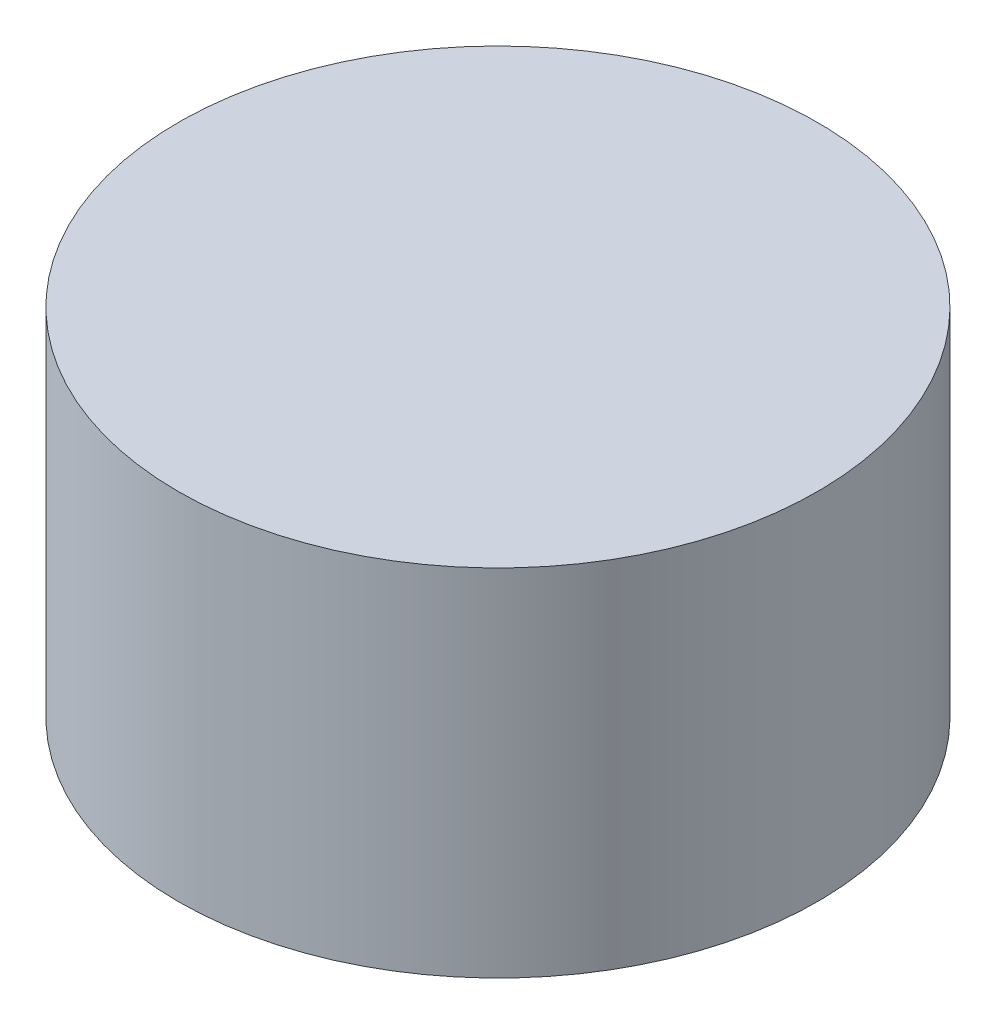
ISO-10303-21;
HEADER;
FILE_DESCRIPTION(('STEP AP214'),'2;1');
FILE_NAME('part.step','',(''),(''),'','','');
FILE_SCHEMA(('AUTOMOTIVE_DESIGN { 1 0 10303 214 1 1 1 1 }'));
ENDSEC;
DATA;
#1=APPLICATION_CONTEXT('core data for automotive mechanical design processes');
#2=APPLICATION_PROTOCOL_DEFINITION('international standard','automotive_design',2000,#1);
#3=PRODUCT_CONTEXT('',#1,'mechanical');
#4=PRODUCT('Part','Part','',(#3));
#5=PRODUCT_RELATED_PRODUCT_CATEGORY('part','',(#4));
#6=PRODUCT_DEFINITION_FORMATION('','',#4);
#7=PRODUCT_DEFINITION_CONTEXT('part definition',#1,'design');
#8=PRODUCT_DEFINITION('design','',#6,#7);
#9=PRODUCT_DEFINITION_SHAPE('','',#8);
#10=(LENGTH_UNIT() NAMED_UNIT(*) SI_UNIT(.MILLI.,.METRE.));
#11=(NAMED_UNIT(*) PLANE_ANGLE_UNIT() SI_UNIT($,.RADIAN.));
#12=(NAMED_UNIT(*) SI_UNIT($,.STERADIAN.) SOLID_ANGLE_UNIT());
#13=UNCERTAINTY_MEASURE_WITH_UNIT(LENGTH_MEASURE(1.E-05),#10,'distance_accuracy_value','');
#14=(GEOMETRIC_REPRESENTATION_CONTEXT(3) GLOBAL_UNCERTAINTY_ASSIGNED_CONTEXT((#13)) GLOBAL_UNIT_ASSIGNED_CONTEXT((#10,
#11,#12)) REPRESENTATION_CONTEXT('',''));
#15=CARTESIAN_POINT('',(0.,0.,0.));
#16=DIRECTION('',(0.,0.,1.));
#17=DIRECTION('',(1.,0.,0.));
#18=AXIS2_PLACEMENT_3D('',#15,#16,#17);
#19=CARTESIAN_POINT('',(0.,50.,0.));
#20=DIRECTION('',(0.,-1.,0.));
#21=DIRECTION('',(0.,0.,-1.));
#22=AXIS2_PLACEMENT_3D('',#19,#20,#21);
#23=CYLINDRICAL_SURFACE('',#22,45.);
#24=CARTESIAN_POINT('',(0.,50.,0.));
#25=DIRECTION('',(0.,1.,0.));
#26=DIRECTION('',(0.,0.,1.));
#27=AXIS2_PLACEMENT_3D('',#24,#25,#26);
#28=CIRCLE('',#27,45.);
#29=CARTESIAN_POINT('',(0.,50.,45.));
#30=VERTEX_POINT('',#29);
#31=EDGE_CURVE('E10',#30,#30,#28,.T.);
#32=ORIENTED_EDGE('',*,*,#31,.F.);
#33=EDGE_LOOP('',(#32));
#34=FACE_BOUND('',#33,.T.);
#35=CARTESIAN_POINT('',(0.,0.,0.));
#36=DIRECTION('',(0.,1.,0.));
#37=DIRECTION('',(0.,0.,1.));
#38=AXIS2_PLACEMENT_3D('',#35,#36,#37);
#39=CIRCLE('',#38,45.);
#40=CARTESIAN_POINT('',(0.,0.,45.));
#41=VERTEX_POINT('',#40);
#42=EDGE_CURVE('E40',#41,#41,#39,.T.);
#43=ORIENTED_EDGE('',*,*,#42,.T.);
#44=EDGE_LOOP('',(#43));
#45=FACE_BOUND('',#44,.T.);
#46=ADVANCED_FACE('F37',(#34,#45),#23,.T.);
#47=CARTESIAN_POINT('',(0.,50.,0.));
#48=DIRECTION('',(0.,1.,0.));
#49=DIRECTION('',(0.,0.,1.));
#50=AXIS2_PLACEMENT_3D('',#47,#48,#49);
#51=PLANE('',#50);
#52=ORIENTED_EDGE('',*,*,#31,.T.);
#53=EDGE_LOOP('',(#52));
#54=FACE_BOUND('',#53,.T.);
#55=ADVANCED_FACE('F54',(#54),#51,.T.);
#56=CARTESIAN_POINT('',(0.,0.,0.));
#57=DIRECTION('',(0.,1.,0.));
#58=DIRECTION('',(0.,0.,1.));
#59=AXIS2_PLACEMENT_3D('',#56,#57,#58);
#60=PLANE('',#59);
#61=ORIENTED_EDGE('',*,*,#42,.F.);
#62=EDGE_LOOP('',(#61));
#63=FACE_BOUND('',#62,.T.);
#64=ADVANCED_FACE('F52',(#63),#60,.F.);
#65=CLOSED_SHELL('',(#46,#55,#64));
#66=MANIFOLD_SOLID_BREP('B2',#65);
#67=ADVANCED_BREP_SHAPE_REPRESENTATION('',(#18,#66),#14);
#68=SHAPE_DEFINITION_REPRESENTATION(#9,#67);
ENDSEC;
END-ISO-10303-21;
